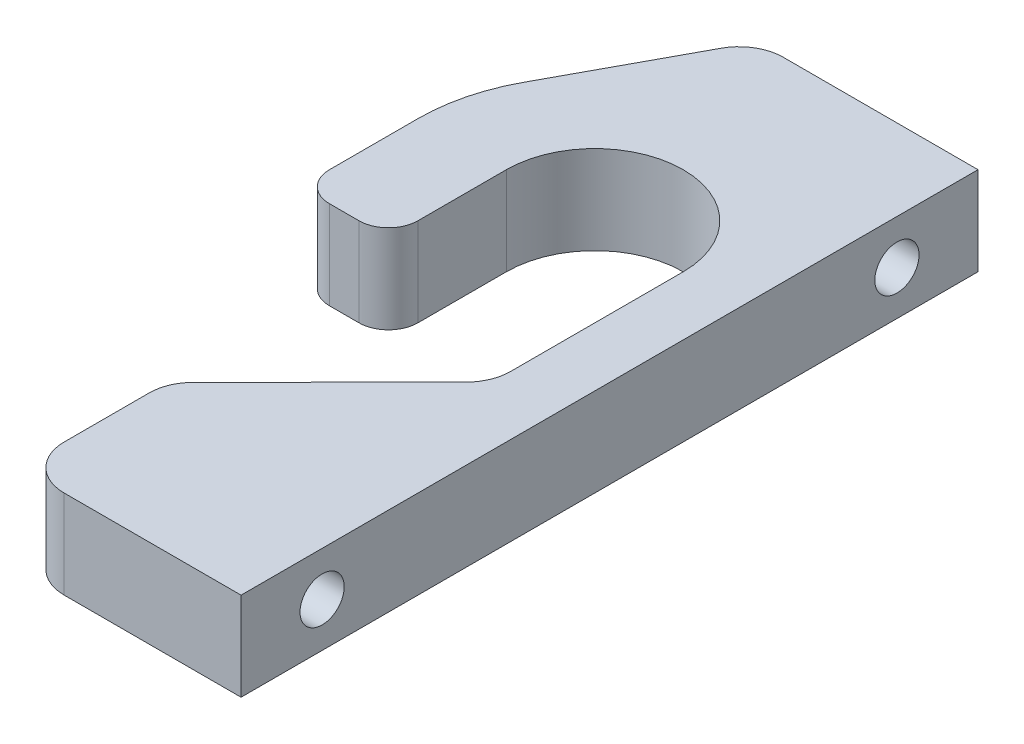
ISO-10303-21;
HEADER;
FILE_DESCRIPTION(('STEP AP214'),'2;1');
FILE_NAME('part.step','',(''),(''),'','','');
FILE_SCHEMA(('AUTOMOTIVE_DESIGN { 1 0 10303 214 1 1 1 1 }'));
ENDSEC;
DATA;
#1=APPLICATION_CONTEXT('core data for automotive mechanical design processes');
#2=APPLICATION_PROTOCOL_DEFINITION('international standard','automotive_design',2000,#1);
#3=PRODUCT_CONTEXT('',#1,'mechanical');
#4=PRODUCT('Part','Part','',(#3));
#5=PRODUCT_RELATED_PRODUCT_CATEGORY('part','',(#4));
#6=PRODUCT_DEFINITION_FORMATION('','',#4);
#7=PRODUCT_DEFINITION_CONTEXT('part definition',#1,'design');
#8=PRODUCT_DEFINITION('design','',#6,#7);
#9=PRODUCT_DEFINITION_SHAPE('','',#8);
#10=(LENGTH_UNIT() NAMED_UNIT(*) SI_UNIT(.MILLI.,.METRE.));
#11=(NAMED_UNIT(*) PLANE_ANGLE_UNIT() SI_UNIT($,.RADIAN.));
#12=(NAMED_UNIT(*) SI_UNIT($,.STERADIAN.) SOLID_ANGLE_UNIT());
#13=UNCERTAINTY_MEASURE_WITH_UNIT(LENGTH_MEASURE(1.E-05),#10,'distance_accuracy_value','');
#14=(GEOMETRIC_REPRESENTATION_CONTEXT(3) GLOBAL_UNCERTAINTY_ASSIGNED_CONTEXT((#13)) GLOBAL_UNIT_ASSIGNED_CONTEXT((#10,
#11,#12)) REPRESENTATION_CONTEXT('',''));
#15=CARTESIAN_POINT('',(0.,0.,0.));
#16=DIRECTION('',(0.,0.,1.));
#17=DIRECTION('',(1.,0.,0.));
#18=AXIS2_PLACEMENT_3D('',#15,#16,#17);
#19=CARTESIAN_POINT('',(0.,3.,0.));
#20=DIRECTION('',(0.,-1.,0.));
#21=DIRECTION('',(0.,0.,-1.));
#22=AXIS2_PLACEMENT_3D('',#19,#20,#21);
#23=CYLINDRICAL_SURFACE('',#22,6.);
#24=CARTESIAN_POINT('',(0.,-3.,0.));
#25=DIRECTION('',(0.,-1.,0.));
#26=DIRECTION('',(0.,0.,1.));
#27=AXIS2_PLACEMENT_3D('',#24,#25,#26);
#28=CIRCLE('',#27,6.);
#29=CARTESIAN_POINT('',(-6.,-3.,0.));
#30=VERTEX_POINT('',#29);
#31=CARTESIAN_POINT('',(6.,-3.,0.));
#32=VERTEX_POINT('',#31);
#33=EDGE_CURVE('E193',#30,#32,#28,.T.);
#34=ORIENTED_EDGE('',*,*,#33,.T.);
#35=DIRECTION('',(0.,-1.,0.));
#36=VECTOR('',#35,1.);
#37=CARTESIAN_POINT('',(6.,3.,0.));
#38=LINE('',#37,#36);
#39=CARTESIAN_POINT('',(6.,3.,0.));
#40=VERTEX_POINT('',#39);
#41=EDGE_CURVE('E172',#40,#32,#38,.T.);
#42=ORIENTED_EDGE('',*,*,#41,.F.);
#43=CARTESIAN_POINT('',(0.,3.,0.));
#44=DIRECTION('',(0.,-1.,0.));
#45=DIRECTION('',(0.,0.,1.));
#46=AXIS2_PLACEMENT_3D('',#43,#44,#45);
#47=CIRCLE('',#46,6.);
#48=CARTESIAN_POINT('',(-6.,3.,0.));
#49=VERTEX_POINT('',#48);
#50=EDGE_CURVE('E180',#49,#40,#47,.T.);
#51=ORIENTED_EDGE('',*,*,#50,.F.);
#52=DIRECTION('',(0.,-1.,0.));
#53=VECTOR('',#52,1.);
#54=CARTESIAN_POINT('',(-6.,3.,0.));
#55=LINE('',#54,#53);
#56=EDGE_CURVE('E280',#49,#30,#55,.T.);
#57=ORIENTED_EDGE('',*,*,#56,.T.);
#58=EDGE_LOOP('',(#34,#42,#51,#57));
#59=FACE_BOUND('',#58,.T.);
#60=ADVANCED_FACE('F39',(#59),#23,.F.);
#61=CARTESIAN_POINT('',(6.,3.,0.));
#62=DIRECTION('',(1.,0.,0.));
#63=DIRECTION('',(0.,0.,-1.));
#64=AXIS2_PLACEMENT_3D('',#61,#62,#63);
#65=PLANE('',#64);
#66=DIRECTION('',(0.,0.,1.));
#67=VECTOR('',#66,1.);
#68=CARTESIAN_POINT('',(6.,-3.,0.));
#69=LINE('',#68,#67);
#70=CARTESIAN_POINT('',(6.,-3.,11.7175913604145));
#71=VERTEX_POINT('',#70);
#72=EDGE_CURVE('E357',#32,#71,#69,.T.);
#73=ORIENTED_EDGE('',*,*,#72,.T.);
#74=DIRECTION('',(0.,-1.,0.));
#75=VECTOR('',#74,1.);
#76=CARTESIAN_POINT('',(6.,3.,11.7175913604145));
#77=LINE('',#76,#75);
#78=CARTESIAN_POINT('',(6.,3.,11.7175913604145));
#79=VERTEX_POINT('',#78);
#80=EDGE_CURVE('E175',#71,#79,#77,.F.);
#81=ORIENTED_EDGE('',*,*,#80,.T.);
#82=DIRECTION('',(0.,0.,1.));
#83=VECTOR('',#82,1.);
#84=CARTESIAN_POINT('',(6.,3.,0.));
#85=LINE('',#84,#83);
#86=EDGE_CURVE('E167',#40,#79,#85,.T.);
#87=ORIENTED_EDGE('',*,*,#86,.F.);
#88=ORIENTED_EDGE('',*,*,#41,.T.);
#89=EDGE_LOOP('',(#73,#81,#87,#88));
#90=FACE_BOUND('',#89,.T.);
#91=ADVANCED_FACE('F170',(#90),#65,.F.);
#92=CARTESIAN_POINT('',(6.,3.,12.9567884805526));
#93=DIRECTION('',(0.708491568107994,0.,0.70571927699325));
#94=DIRECTION('',(0.70571927699325,0.,-0.708491568107994));
#95=AXIS2_PLACEMENT_3D('',#92,#93,#94);
#96=PLANE('',#95);
#97=DIRECTION('',(-0.70571927699325,0.,0.708491568107994));
#98=VECTOR('',#97,1.);
#99=CARTESIAN_POINT('',(6.,-3.,12.9567884805526));
#100=LINE('',#99,#98);
#101=CARTESIAN_POINT('',(5.12547470432399,-3.,13.8347491913942));
#102=VERTEX_POINT('',#101);
#103=CARTESIAN_POINT('',(-4.12547470432397,-3.,23.1220392891584));
#104=VERTEX_POINT('',#103);
#105=EDGE_CURVE('E361',#102,#104,#100,.T.);
#106=ORIENTED_EDGE('',*,*,#105,.T.);
#107=DIRECTION('',(0.,-1.,0.));
#108=VECTOR('',#107,1.);
#109=CARTESIAN_POINT('',(-4.12547470432397,3.,23.1220392891584));
#110=LINE('',#109,#108);
#111=CARTESIAN_POINT('',(-4.12547470432397,3.,23.1220392891584));
#112=VERTEX_POINT('',#111);
#113=EDGE_CURVE('E243',#104,#112,#110,.F.);
#114=ORIENTED_EDGE('',*,*,#113,.T.);
#115=DIRECTION('',(-0.70571927699325,0.,0.708491568107994));
#116=VECTOR('',#115,1.);
#117=CARTESIAN_POINT('',(6.,3.,12.9567884805526));
#118=LINE('',#117,#116);
#119=CARTESIAN_POINT('',(5.12547470432399,3.,13.8347491913942));
#120=VERTEX_POINT('',#119);
#121=EDGE_CURVE('E179',#120,#112,#118,.T.);
#122=ORIENTED_EDGE('',*,*,#121,.F.);
#123=DIRECTION('',(0.,-1.,0.));
#124=VECTOR('',#123,1.);
#125=CARTESIAN_POINT('',(5.12547470432398,-3.,13.8347491913942));
#126=LINE('',#125,#124);
#127=EDGE_CURVE('E239',#120,#102,#126,.T.);
#128=ORIENTED_EDGE('',*,*,#127,.T.);
#129=EDGE_LOOP('',(#106,#114,#122,#128));
#130=FACE_BOUND('',#129,.T.);
#131=ADVANCED_FACE('F415',(#130),#96,.F.);
#132=CARTESIAN_POINT('',(-4.99999999999999,3.,24.));
#133=DIRECTION('',(1.,0.,0.));
#134=DIRECTION('',(0.,0.,-1.));
#135=AXIS2_PLACEMENT_3D('',#132,#133,#134);
#136=PLANE('',#135);
#137=DIRECTION('',(0.,0.,1.));
#138=VECTOR('',#137,1.);
#139=CARTESIAN_POINT('',(-4.99999999999999,-3.,24.));
#140=LINE('',#139,#138);
#141=CARTESIAN_POINT('',(-4.99999999999999,-3.,25.2391971201382));
#142=VERTEX_POINT('',#141);
#143=CARTESIAN_POINT('',(-4.99999999999999,-3.,31.));
#144=VERTEX_POINT('',#143);
#145=EDGE_CURVE('E365',#142,#144,#140,.T.);
#146=ORIENTED_EDGE('',*,*,#145,.T.);
#147=DIRECTION('',(0.,-1.,0.));
#148=VECTOR('',#147,1.);
#149=CARTESIAN_POINT('',(-4.99999999999999,3.,31.));
#150=LINE('',#149,#148);
#151=CARTESIAN_POINT('',(-4.99999999999999,3.,31.));
#152=VERTEX_POINT('',#151);
#153=EDGE_CURVE('E220',#144,#152,#150,.F.);
#154=ORIENTED_EDGE('',*,*,#153,.T.);
#155=DIRECTION('',(0.,0.,1.));
#156=VECTOR('',#155,1.);
#157=CARTESIAN_POINT('',(-4.99999999999999,3.,24.));
#158=LINE('',#157,#156);
#159=CARTESIAN_POINT('',(-4.99999999999999,3.,25.2391971201382));
#160=VERTEX_POINT('',#159);
#161=EDGE_CURVE('E383',#160,#152,#158,.T.);
#162=ORIENTED_EDGE('',*,*,#161,.F.);
#163=DIRECTION('',(0.,-1.,0.));
#164=VECTOR('',#163,1.);
#165=CARTESIAN_POINT('',(-4.99999999999999,3.,25.2391971201382));
#166=LINE('',#165,#164);
#167=EDGE_CURVE('E216',#160,#142,#166,.T.);
#168=ORIENTED_EDGE('',*,*,#167,.T.);
#169=EDGE_LOOP('',(#146,#154,#162,#168));
#170=FACE_BOUND('',#169,.T.);
#171=ADVANCED_FACE('F420',(#170),#136,.F.);
#172=CARTESIAN_POINT('',(-4.99999999999999,3.,34.));
#173=DIRECTION('',(0.,0.,-1.));
#174=DIRECTION('',(-1.,0.,0.));
#175=AXIS2_PLACEMENT_3D('',#172,#173,#174);
#176=PLANE('',#175);
#177=DIRECTION('',(1.,0.,0.));
#178=VECTOR('',#177,1.);
#179=CARTESIAN_POINT('',(-4.99999999999999,3.,34.));
#180=LINE('',#179,#178);
#181=CARTESIAN_POINT('',(-1.99999999999999,3.,34.));
#182=VERTEX_POINT('',#181);
#183=CARTESIAN_POINT('',(10.,3.,34.));
#184=VERTEX_POINT('',#183);
#185=EDGE_CURVE('E377',#182,#184,#180,.T.);
#186=ORIENTED_EDGE('',*,*,#185,.F.);
#187=DIRECTION('',(0.,-1.,0.));
#188=VECTOR('',#187,1.);
#189=CARTESIAN_POINT('',(-1.99999999999999,3.,34.));
#190=LINE('',#189,#188);
#191=CARTESIAN_POINT('',(-1.99999999999999,-3.,34.));
#192=VERTEX_POINT('',#191);
#193=EDGE_CURVE('E195',#182,#192,#190,.T.);
#194=ORIENTED_EDGE('',*,*,#193,.T.);
#195=DIRECTION('',(1.,0.,0.));
#196=VECTOR('',#195,1.);
#197=CARTESIAN_POINT('',(-4.99999999999999,-3.,34.));
#198=LINE('',#197,#196);
#199=CARTESIAN_POINT('',(10.,-3.,34.));
#200=VERTEX_POINT('',#199);
#201=EDGE_CURVE('E333',#192,#200,#198,.T.);
#202=ORIENTED_EDGE('',*,*,#201,.T.);
#203=DIRECTION('',(0.,-1.,0.));
#204=VECTOR('',#203,1.);
#205=CARTESIAN_POINT('',(10.,3.,34.));
#206=LINE('',#205,#204);
#207=EDGE_CURVE('E196',#184,#200,#206,.T.);
#208=ORIENTED_EDGE('',*,*,#207,.F.);
#209=EDGE_LOOP('',(#186,#194,#202,#208));
#210=FACE_BOUND('',#209,.T.);
#211=ADVANCED_FACE('F372',(#210),#176,.F.);
#212=CARTESIAN_POINT('',(10.,3.,34.));
#213=DIRECTION('',(-1.,0.,0.));
#214=DIRECTION('',(0.,0.,1.));
#215=AXIS2_PLACEMENT_3D('',#212,#213,#214);
#216=PLANE('',#215);
#217=CARTESIAN_POINT('',(10.,0.,28.5));
#218=DIRECTION('',(1.,0.,0.));
#219=DIRECTION('',(0.,0.,-1.));
#220=AXIS2_PLACEMENT_3D('',#217,#218,#219);
#221=CIRCLE('',#220,1.5);
#222=CARTESIAN_POINT('',(10.,0.,27.));
#223=VERTEX_POINT('',#222);
#224=EDGE_CURVE('E465',#223,#223,#221,.T.);
#225=ORIENTED_EDGE('',*,*,#224,.F.);
#226=EDGE_LOOP('',(#225));
#227=FACE_BOUND('',#226,.T.);
#228=CARTESIAN_POINT('',(10.,0.,-10.5));
#229=DIRECTION('',(1.,0.,0.));
#230=DIRECTION('',(0.,0.,-1.));
#231=AXIS2_PLACEMENT_3D('',#228,#229,#230);
#232=CIRCLE('',#231,1.5);
#233=CARTESIAN_POINT('',(10.,0.,-12.));
#234=VERTEX_POINT('',#233);
#235=EDGE_CURVE('E475',#234,#234,#232,.T.);
#236=ORIENTED_EDGE('',*,*,#235,.F.);
#237=EDGE_LOOP('',(#236));
#238=FACE_BOUND('',#237,.T.);
#239=DIRECTION('',(0.,0.,-1.));
#240=VECTOR('',#239,1.);
#241=CARTESIAN_POINT('',(10.,-3.,34.));
#242=LINE('',#241,#240);
#243=CARTESIAN_POINT('',(10.,-3.,-16.));
#244=VERTEX_POINT('',#243);
#245=EDGE_CURVE('E325',#200,#244,#242,.T.);
#246=ORIENTED_EDGE('',*,*,#245,.T.);
#247=DIRECTION('',(0.,-1.,0.));
#248=VECTOR('',#247,1.);
#249=CARTESIAN_POINT('',(10.,3.,-16.));
#250=LINE('',#249,#248);
#251=CARTESIAN_POINT('',(10.,3.,-16.));
#252=VERTEX_POINT('',#251);
#253=EDGE_CURVE('E204',#252,#244,#250,.T.);
#254=ORIENTED_EDGE('',*,*,#253,.F.);
#255=DIRECTION('',(0.,0.,-1.));
#256=VECTOR('',#255,1.);
#257=CARTESIAN_POINT('',(10.,3.,34.));
#258=LINE('',#257,#256);
#259=EDGE_CURVE('E375',#184,#252,#258,.T.);
#260=ORIENTED_EDGE('',*,*,#259,.F.);
#261=ORIENTED_EDGE('',*,*,#207,.T.);
#262=EDGE_LOOP('',(#246,#254,#260,#261));
#263=FACE_BOUND('',#262,.T.);
#264=ADVANCED_FACE('F374',(#227,#238,#263),#216,.F.);
#265=CARTESIAN_POINT('',(-5.,3.,-16.));
#266=DIRECTION('',(0.,0.,1.));
#267=DIRECTION('',(1.,0.,0.));
#268=AXIS2_PLACEMENT_3D('',#265,#266,#267);
#269=PLANE('',#268);
#270=DIRECTION('',(-1.,0.,0.));
#271=VECTOR('',#270,1.);
#272=CARTESIAN_POINT('',(-5.,-3.,-16.));
#273=LINE('',#272,#271);
#274=CARTESIAN_POINT('',(-3.21021072385147,-3.,-16.));
#275=VERTEX_POINT('',#274);
#276=EDGE_CURVE('E317',#244,#275,#273,.T.);
#277=ORIENTED_EDGE('',*,*,#276,.T.);
#278=DIRECTION('',(0.,-1.,0.));
#279=VECTOR('',#278,1.);
#280=CARTESIAN_POINT('',(-3.21021072385147,3.,-16.));
#281=LINE('',#280,#279);
#282=CARTESIAN_POINT('',(-3.21021072385147,3.,-16.));
#283=VERTEX_POINT('',#282);
#284=EDGE_CURVE('E236',#275,#283,#281,.F.);
#285=ORIENTED_EDGE('',*,*,#284,.T.);
#286=DIRECTION('',(-1.,0.,0.));
#287=VECTOR('',#286,1.);
#288=CARTESIAN_POINT('',(-5.,3.,-16.));
#289=LINE('',#288,#287);
#290=EDGE_CURVE('E320',#252,#283,#289,.T.);
#291=ORIENTED_EDGE('',*,*,#290,.F.);
#292=ORIENTED_EDGE('',*,*,#253,.T.);
#293=EDGE_LOOP('',(#277,#285,#291,#292));
#294=FACE_BOUND('',#293,.T.);
#295=ADVANCED_FACE('F316',(#294),#269,.F.);
#296=CARTESIAN_POINT('',(-10.5597949567906,3.,-5.70006407600293));
#297=DIRECTION('',(0.879982913065886,0.,0.475005339666911));
#298=DIRECTION('',(0.475005339666911,0.,-0.879982913065886));
#299=AXIS2_PLACEMENT_3D('',#296,#297,#298);
#300=PLANE('',#299);
#301=DIRECTION('',(-0.475005339666911,0.,0.879982913065886));
#302=VECTOR('',#301,1.);
#303=CARTESIAN_POINT('',(-10.5597949567906,3.,-5.70006407600293));
#304=LINE('',#303,#302);
#305=CARTESIAN_POINT('',(-5.85015946304912,3.,-14.4250160190007));
#306=VERTEX_POINT('',#305);
#307=CARTESIAN_POINT('',(-10.5597949567906,3.,-5.70006407600293));
#308=VERTEX_POINT('',#307);
#309=EDGE_CURVE('E381',#306,#308,#304,.T.);
#310=ORIENTED_EDGE('',*,*,#309,.F.);
#311=DIRECTION('',(0.,-1.,0.));
#312=VECTOR('',#311,1.);
#313=CARTESIAN_POINT('',(-5.85015946304912,3.,-14.4250160190007));
#314=LINE('',#313,#312);
#315=CARTESIAN_POINT('',(-5.85015946304912,-3.,-14.4250160190007));
#316=VERTEX_POINT('',#315);
#317=EDGE_CURVE('E232',#306,#316,#314,.T.);
#318=ORIENTED_EDGE('',*,*,#317,.T.);
#319=DIRECTION('',(-0.475005339666911,0.,0.879982913065886));
#320=VECTOR('',#319,1.);
#321=CARTESIAN_POINT('',(-10.5597949567906,-3.,-5.70006407600293));
#322=LINE('',#321,#320);
#323=CARTESIAN_POINT('',(-10.5597949567906,-3.,-5.70006407600293));
#324=VERTEX_POINT('',#323);
#325=EDGE_CURVE('E328',#316,#324,#322,.T.);
#326=ORIENTED_EDGE('',*,*,#325,.T.);
#327=DIRECTION('',(0.,-1.,0.));
#328=VECTOR('',#327,1.);
#329=CARTESIAN_POINT('',(-10.5597949567906,3.,-5.70006407600293));
#330=LINE('',#329,#328);
#331=EDGE_CURVE('E306',#308,#324,#330,.T.);
#332=ORIENTED_EDGE('',*,*,#331,.F.);
#333=EDGE_LOOP('',(#310,#318,#326,#332));
#334=FACE_BOUND('',#333,.T.);
#335=ADVANCED_FACE('F393',(#334),#300,.F.);
#336=CARTESIAN_POINT('',(0.,3.,0.));
#337=DIRECTION('',(0.,-1.,0.));
#338=DIRECTION('',(0.,0.,-1.));
#339=AXIS2_PLACEMENT_3D('',#336,#337,#338);
#340=CYLINDRICAL_SURFACE('',#339,12.);
#341=CARTESIAN_POINT('',(0.,-3.,0.));
#342=DIRECTION('',(0.,1.,0.));
#343=DIRECTION('',(0.,0.,1.));
#344=AXIS2_PLACEMENT_3D('',#341,#342,#343);
#345=CIRCLE('',#344,12.);
#346=CARTESIAN_POINT('',(-12.,-3.,0.));
#347=VERTEX_POINT('',#346);
#348=EDGE_CURVE('E296',#324,#347,#345,.T.);
#349=ORIENTED_EDGE('',*,*,#348,.T.);
#350=DIRECTION('',(0.,-1.,0.));
#351=VECTOR('',#350,1.);
#352=CARTESIAN_POINT('',(-12.,3.,0.));
#353=LINE('',#352,#351);
#354=CARTESIAN_POINT('',(-12.,3.,0.));
#355=VERTEX_POINT('',#354);
#356=EDGE_CURVE('E302',#355,#347,#353,.T.);
#357=ORIENTED_EDGE('',*,*,#356,.F.);
#358=CARTESIAN_POINT('',(0.,3.,0.));
#359=DIRECTION('',(0.,1.,0.));
#360=DIRECTION('',(0.,0.,1.));
#361=AXIS2_PLACEMENT_3D('',#358,#359,#360);
#362=CIRCLE('',#361,12.);
#363=EDGE_CURVE('E351',#308,#355,#362,.T.);
#364=ORIENTED_EDGE('',*,*,#363,.F.);
#365=ORIENTED_EDGE('',*,*,#331,.T.);
#366=EDGE_LOOP('',(#349,#357,#364,#365));
#367=FACE_BOUND('',#366,.T.);
#368=ADVANCED_FACE('F340',(#367),#340,.T.);
#369=CARTESIAN_POINT('',(-12.,3.,0.));
#370=DIRECTION('',(1.,0.,0.));
#371=DIRECTION('',(0.,0.,-1.));
#372=AXIS2_PLACEMENT_3D('',#369,#370,#371);
#373=PLANE('',#372);
#374=DIRECTION('',(0.,0.,1.));
#375=VECTOR('',#374,1.);
#376=CARTESIAN_POINT('',(-12.,-3.,0.));
#377=LINE('',#376,#375);
#378=CARTESIAN_POINT('',(-12.,-3.,6.));
#379=VERTEX_POINT('',#378);
#380=EDGE_CURVE('E291',#347,#379,#377,.T.);
#381=ORIENTED_EDGE('',*,*,#380,.T.);
#382=DIRECTION('',(0.,-1.,0.));
#383=VECTOR('',#382,1.);
#384=CARTESIAN_POINT('',(-12.,3.,6.));
#385=LINE('',#384,#383);
#386=CARTESIAN_POINT('',(-12.,3.,6.));
#387=VERTEX_POINT('',#386);
#388=EDGE_CURVE('E11',#379,#387,#385,.F.);
#389=ORIENTED_EDGE('',*,*,#388,.T.);
#390=DIRECTION('',(0.,0.,1.));
#391=VECTOR('',#390,1.);
#392=CARTESIAN_POINT('',(-12.,3.,0.));
#393=LINE('',#392,#391);
#394=EDGE_CURVE('E345',#355,#387,#393,.T.);
#395=ORIENTED_EDGE('',*,*,#394,.F.);
#396=ORIENTED_EDGE('',*,*,#356,.T.);
#397=EDGE_LOOP('',(#381,#389,#395,#396));
#398=FACE_BOUND('',#397,.T.);
#399=ADVANCED_FACE('F344',(#398),#373,.F.);
#400=CARTESIAN_POINT('',(-12.,3.,8.));
#401=DIRECTION('',(0.,0.,-1.));
#402=DIRECTION('',(-1.,0.,0.));
#403=AXIS2_PLACEMENT_3D('',#400,#401,#402);
#404=PLANE('',#403);
#405=DIRECTION('',(1.,0.,0.));
#406=VECTOR('',#405,1.);
#407=CARTESIAN_POINT('',(-12.,-3.,8.));
#408=LINE('',#407,#406);
#409=CARTESIAN_POINT('',(-10.,-3.,8.));
#410=VERTEX_POINT('',#409);
#411=CARTESIAN_POINT('',(-8.,-3.,8.));
#412=VERTEX_POINT('',#411);
#413=EDGE_CURVE('E287',#410,#412,#408,.T.);
#414=ORIENTED_EDGE('',*,*,#413,.T.);
#415=DIRECTION('',(0.,-1.,0.));
#416=VECTOR('',#415,1.);
#417=CARTESIAN_POINT('',(-8.,3.,8.));
#418=LINE('',#417,#416);
#419=CARTESIAN_POINT('',(-8.,3.,8.));
#420=VERTEX_POINT('',#419);
#421=EDGE_CURVE('E61',#412,#420,#418,.F.);
#422=ORIENTED_EDGE('',*,*,#421,.T.);
#423=DIRECTION('',(1.,0.,0.));
#424=VECTOR('',#423,1.);
#425=CARTESIAN_POINT('',(-12.,3.,8.));
#426=LINE('',#425,#424);
#427=CARTESIAN_POINT('',(-10.,3.,8.));
#428=VERTEX_POINT('',#427);
#429=EDGE_CURVE('E274',#428,#420,#426,.T.);
#430=ORIENTED_EDGE('',*,*,#429,.F.);
#431=DIRECTION('',(0.,-1.,0.));
#432=VECTOR('',#431,1.);
#433=CARTESIAN_POINT('',(-10.,3.,8.));
#434=LINE('',#433,#432);
#435=EDGE_CURVE('E264',#428,#410,#434,.T.);
#436=ORIENTED_EDGE('',*,*,#435,.T.);
#437=EDGE_LOOP('',(#414,#422,#430,#436));
#438=FACE_BOUND('',#437,.T.);
#439=ADVANCED_FACE('F288',(#438),#404,.F.);
#440=CARTESIAN_POINT('',(-6.,3.,8.));
#441=DIRECTION('',(-1.,0.,0.));
#442=DIRECTION('',(0.,0.,1.));
#443=AXIS2_PLACEMENT_3D('',#440,#441,#442);
#444=PLANE('',#443);
#445=DIRECTION('',(0.,0.,-1.));
#446=VECTOR('',#445,1.);
#447=CARTESIAN_POINT('',(-6.,3.,8.));
#448=LINE('',#447,#446);
#449=CARTESIAN_POINT('',(-6.,3.,6.));
#450=VERTEX_POINT('',#449);
#451=EDGE_CURVE('E185',#450,#49,#448,.T.);
#452=ORIENTED_EDGE('',*,*,#451,.F.);
#453=DIRECTION('',(0.,-1.,0.));
#454=VECTOR('',#453,1.);
#455=CARTESIAN_POINT('',(-6.,3.,6.));
#456=LINE('',#455,#454);
#457=CARTESIAN_POINT('',(-6.,-3.,6.));
#458=VERTEX_POINT('',#457);
#459=EDGE_CURVE('E254',#450,#458,#456,.T.);
#460=ORIENTED_EDGE('',*,*,#459,.T.);
#461=DIRECTION('',(0.,0.,-1.));
#462=VECTOR('',#461,1.);
#463=CARTESIAN_POINT('',(-6.,-3.,8.));
#464=LINE('',#463,#462);
#465=EDGE_CURVE('E190',#458,#30,#464,.T.);
#466=ORIENTED_EDGE('',*,*,#465,.T.);
#467=ORIENTED_EDGE('',*,*,#56,.F.);
#468=EDGE_LOOP('',(#452,#460,#466,#467));
#469=FACE_BOUND('',#468,.T.);
#470=ADVANCED_FACE('F278',(#469),#444,.F.);
#471=CARTESIAN_POINT('',(0.,3.,0.));
#472=DIRECTION('',(0.,1.,0.));
#473=DIRECTION('',(0.,0.,1.));
#474=AXIS2_PLACEMENT_3D('',#471,#472,#473);
#475=PLANE('',#474);
#476=ORIENTED_EDGE('',*,*,#429,.T.);
#477=CARTESIAN_POINT('',(-8.,3.,6.));
#478=DIRECTION('',(0.,1.,0.));
#479=DIRECTION('',(0.,0.,1.));
#480=AXIS2_PLACEMENT_3D('',#477,#478,#479);
#481=CIRCLE('',#480,2.);
#482=EDGE_CURVE('E48',#420,#450,#481,.T.);
#483=ORIENTED_EDGE('',*,*,#482,.T.);
#484=ORIENTED_EDGE('',*,*,#451,.T.);
#485=ORIENTED_EDGE('',*,*,#50,.T.);
#486=ORIENTED_EDGE('',*,*,#86,.T.);
#487=CARTESIAN_POINT('',(3.,3.,11.7175913604145));
#488=DIRECTION('',(0.,1.,0.));
#489=DIRECTION('',(0.,0.,1.));
#490=AXIS2_PLACEMENT_3D('',#487,#488,#489);
#491=CIRCLE('',#490,3.);
#492=EDGE_CURVE('E251',#79,#120,#491,.F.);
#493=ORIENTED_EDGE('',*,*,#492,.T.);
#494=ORIENTED_EDGE('',*,*,#121,.T.);
#495=CARTESIAN_POINT('',(-1.99999999999999,3.,25.2391971201382));
#496=DIRECTION('',(0.,1.,0.));
#497=DIRECTION('',(0.,0.,1.));
#498=AXIS2_PLACEMENT_3D('',#495,#496,#497);
#499=CIRCLE('',#498,3.);
#500=EDGE_CURVE('E223',#112,#160,#499,.T.);
#501=ORIENTED_EDGE('',*,*,#500,.T.);
#502=ORIENTED_EDGE('',*,*,#161,.T.);
#503=CARTESIAN_POINT('',(-1.99999999999999,3.,31.));
#504=DIRECTION('',(0.,1.,0.));
#505=DIRECTION('',(0.,0.,1.));
#506=AXIS2_PLACEMENT_3D('',#503,#504,#505);
#507=CIRCLE('',#506,3.);
#508=EDGE_CURVE('E229',#152,#182,#507,.T.);
#509=ORIENTED_EDGE('',*,*,#508,.T.);
#510=ORIENTED_EDGE('',*,*,#185,.T.);
#511=ORIENTED_EDGE('',*,*,#259,.T.);
#512=ORIENTED_EDGE('',*,*,#290,.T.);
#513=CARTESIAN_POINT('',(-3.21021072385147,3.,-13.));
#514=DIRECTION('',(0.,1.,0.));
#515=DIRECTION('',(0.,0.,1.));
#516=AXIS2_PLACEMENT_3D('',#513,#514,#515);
#517=CIRCLE('',#516,3.);
#518=EDGE_CURVE('E226',#283,#306,#517,.T.);
#519=ORIENTED_EDGE('',*,*,#518,.T.);
#520=ORIENTED_EDGE('',*,*,#309,.T.);
#521=ORIENTED_EDGE('',*,*,#363,.T.);
#522=ORIENTED_EDGE('',*,*,#394,.T.);
#523=CARTESIAN_POINT('',(-10.,3.,6.));
#524=DIRECTION('',(0.,1.,0.));
#525=DIRECTION('',(0.,0.,1.));
#526=AXIS2_PLACEMENT_3D('',#523,#524,#525);
#527=CIRCLE('',#526,2.);
#528=EDGE_CURVE('E270',#387,#428,#527,.T.);
#529=ORIENTED_EDGE('',*,*,#528,.T.);
#530=EDGE_LOOP('',(#476,#483,#484,#485,#486,#493,#494,#501,#502,#509,#510,#511,#512,#519,#520,
#521,#522,#529));
#531=FACE_BOUND('',#530,.T.);
#532=ADVANCED_FACE('F183',(#531),#475,.T.);
#533=CARTESIAN_POINT('',(0.,-3.,0.));
#534=DIRECTION('',(0.,1.,0.));
#535=DIRECTION('',(0.,0.,1.));
#536=AXIS2_PLACEMENT_3D('',#533,#534,#535);
#537=PLANE('',#536);
#538=ORIENTED_EDGE('',*,*,#465,.F.);
#539=CARTESIAN_POINT('',(-8.,-3.,6.));
#540=DIRECTION('',(0.,1.,0.));
#541=DIRECTION('',(0.,0.,1.));
#542=AXIS2_PLACEMENT_3D('',#539,#540,#541);
#543=CIRCLE('',#542,2.);
#544=EDGE_CURVE('E261',#458,#412,#543,.F.);
#545=ORIENTED_EDGE('',*,*,#544,.T.);
#546=ORIENTED_EDGE('',*,*,#413,.F.);
#547=CARTESIAN_POINT('',(-10.,-3.,6.));
#548=DIRECTION('',(0.,1.,0.));
#549=DIRECTION('',(0.,0.,1.));
#550=AXIS2_PLACEMENT_3D('',#547,#548,#549);
#551=CIRCLE('',#550,2.);
#552=EDGE_CURVE('E258',#410,#379,#551,.F.);
#553=ORIENTED_EDGE('',*,*,#552,.T.);
#554=ORIENTED_EDGE('',*,*,#380,.F.);
#555=ORIENTED_EDGE('',*,*,#348,.F.);
#556=ORIENTED_EDGE('',*,*,#325,.F.);
#557=CARTESIAN_POINT('',(-3.21021072385147,-3.,-13.));
#558=DIRECTION('',(0.,1.,0.));
#559=DIRECTION('',(0.,0.,1.));
#560=AXIS2_PLACEMENT_3D('',#557,#558,#559);
#561=CIRCLE('',#560,3.);
#562=EDGE_CURVE('E210',#316,#275,#561,.F.);
#563=ORIENTED_EDGE('',*,*,#562,.T.);
#564=ORIENTED_EDGE('',*,*,#276,.F.);
#565=ORIENTED_EDGE('',*,*,#245,.F.);
#566=ORIENTED_EDGE('',*,*,#201,.F.);
#567=CARTESIAN_POINT('',(-1.99999999999999,-3.,31.));
#568=DIRECTION('',(0.,1.,0.));
#569=DIRECTION('',(0.,0.,1.));
#570=AXIS2_PLACEMENT_3D('',#567,#568,#569);
#571=CIRCLE('',#570,3.);
#572=EDGE_CURVE('E213',#192,#144,#571,.F.);
#573=ORIENTED_EDGE('',*,*,#572,.T.);
#574=ORIENTED_EDGE('',*,*,#145,.F.);
#575=CARTESIAN_POINT('',(-1.99999999999999,-3.,25.2391971201382));
#576=DIRECTION('',(0.,1.,0.));
#577=DIRECTION('',(0.,0.,1.));
#578=AXIS2_PLACEMENT_3D('',#575,#576,#577);
#579=CIRCLE('',#578,3.);
#580=EDGE_CURVE('E201',#142,#104,#579,.F.);
#581=ORIENTED_EDGE('',*,*,#580,.T.);
#582=ORIENTED_EDGE('',*,*,#105,.F.);
#583=CARTESIAN_POINT('',(3.,-3.,11.7175913604145));
#584=DIRECTION('',(0.,1.,0.));
#585=DIRECTION('',(0.,0.,1.));
#586=AXIS2_PLACEMENT_3D('',#583,#584,#585);
#587=CIRCLE('',#586,3.);
#588=EDGE_CURVE('E248',#102,#71,#587,.T.);
#589=ORIENTED_EDGE('',*,*,#588,.T.);
#590=ORIENTED_EDGE('',*,*,#72,.F.);
#591=ORIENTED_EDGE('',*,*,#33,.F.);
#592=EDGE_LOOP('',(#538,#545,#546,#553,#554,#555,#556,#563,#564,#565,#566,#573,#574,#581,#582,
#589,#590,#591));
#593=FACE_BOUND('',#592,.T.);
#594=ADVANCED_FACE('F286',(#593),#537,.F.);
#595=CARTESIAN_POINT('',(0.,0.,-10.5));
#596=DIRECTION('',(1.,0.,0.));
#597=DIRECTION('',(0.,0.,-1.));
#598=AXIS2_PLACEMENT_3D('',#595,#596,#597);
#599=CYLINDRICAL_SURFACE('',#598,1.5);
#600=CARTESIAN_POINT('',(0.,0.,-10.5));
#601=DIRECTION('',(1.,0.,0.));
#602=DIRECTION('',(0.,0.,-1.));
#603=AXIS2_PLACEMENT_3D('',#600,#601,#602);
#604=CIRCLE('',#603,1.5);
#605=CARTESIAN_POINT('',(0.,0.,-12.));
#606=VERTEX_POINT('',#605);
#607=EDGE_CURVE('E469',#606,#606,#604,.T.);
#608=ORIENTED_EDGE('',*,*,#607,.F.);
#609=EDGE_LOOP('',(#608));
#610=FACE_BOUND('',#609,.T.);
#611=ORIENTED_EDGE('',*,*,#235,.T.);
#612=EDGE_LOOP('',(#611));
#613=FACE_BOUND('',#612,.T.);
#614=ADVANCED_FACE('F444',(#610,#613),#599,.F.);
#615=CARTESIAN_POINT('',(0.,0.,0.));
#616=DIRECTION('',(1.,0.,0.));
#617=DIRECTION('',(0.,0.,-1.));
#618=AXIS2_PLACEMENT_3D('',#615,#616,#617);
#619=PLANE('',#618);
#620=ORIENTED_EDGE('',*,*,#607,.T.);
#621=EDGE_LOOP('',(#620));
#622=FACE_BOUND('',#621,.T.);
#623=ADVANCED_FACE('F449',(#622),#619,.T.);
#624=CARTESIAN_POINT('',(0.,0.,28.5));
#625=DIRECTION('',(1.,0.,0.));
#626=DIRECTION('',(0.,0.,-1.));
#627=AXIS2_PLACEMENT_3D('',#624,#625,#626);
#628=CYLINDRICAL_SURFACE('',#627,1.5);
#629=CARTESIAN_POINT('',(0.,0.,28.5));
#630=DIRECTION('',(1.,0.,0.));
#631=DIRECTION('',(0.,0.,-1.));
#632=AXIS2_PLACEMENT_3D('',#629,#630,#631);
#633=CIRCLE('',#632,1.5);
#634=CARTESIAN_POINT('',(0.,0.,27.));
#635=VERTEX_POINT('',#634);
#636=EDGE_CURVE('E358',#635,#635,#633,.T.);
#637=ORIENTED_EDGE('',*,*,#636,.F.);
#638=EDGE_LOOP('',(#637));
#639=FACE_BOUND('',#638,.T.);
#640=ORIENTED_EDGE('',*,*,#224,.T.);
#641=EDGE_LOOP('',(#640));
#642=FACE_BOUND('',#641,.T.);
#643=ADVANCED_FACE('F453',(#639,#642),#628,.F.);
#644=CARTESIAN_POINT('',(0.,0.,0.));
#645=DIRECTION('',(1.,0.,0.));
#646=DIRECTION('',(0.,0.,-1.));
#647=AXIS2_PLACEMENT_3D('',#644,#645,#646);
#648=PLANE('',#647);
#649=ORIENTED_EDGE('',*,*,#636,.T.);
#650=EDGE_LOOP('',(#649));
#651=FACE_BOUND('',#650,.T.);
#652=ADVANCED_FACE('F407',(#651),#648,.T.);
#653=CARTESIAN_POINT('',(-1.99999999999999,3.,31.));
#654=DIRECTION('',(0.,-1.,0.));
#655=DIRECTION('',(0.,0.,-1.));
#656=AXIS2_PLACEMENT_3D('',#653,#654,#655);
#657=CYLINDRICAL_SURFACE('',#656,3.);
#658=ORIENTED_EDGE('',*,*,#508,.F.);
#659=ORIENTED_EDGE('',*,*,#153,.F.);
#660=ORIENTED_EDGE('',*,*,#572,.F.);
#661=ORIENTED_EDGE('',*,*,#193,.F.);
#662=EDGE_LOOP('',(#658,#659,#660,#661));
#663=FACE_BOUND('',#662,.T.);
#664=ADVANCED_FACE('F398',(#663),#657,.T.);
#665=CARTESIAN_POINT('',(-3.21021072385147,3.,-13.));
#666=DIRECTION('',(0.,-1.,0.));
#667=DIRECTION('',(0.,0.,-1.));
#668=AXIS2_PLACEMENT_3D('',#665,#666,#667);
#669=CYLINDRICAL_SURFACE('',#668,3.);
#670=ORIENTED_EDGE('',*,*,#518,.F.);
#671=ORIENTED_EDGE('',*,*,#284,.F.);
#672=ORIENTED_EDGE('',*,*,#562,.F.);
#673=ORIENTED_EDGE('',*,*,#317,.F.);
#674=EDGE_LOOP('',(#670,#671,#672,#673));
#675=FACE_BOUND('',#674,.T.);
#676=ADVANCED_FACE('F395',(#675),#669,.T.);
#677=CARTESIAN_POINT('',(-1.99999999999999,3.,25.2391971201382));
#678=DIRECTION('',(0.,-1.,0.));
#679=DIRECTION('',(0.,0.,-1.));
#680=AXIS2_PLACEMENT_3D('',#677,#678,#679);
#681=CYLINDRICAL_SURFACE('',#680,3.);
#682=ORIENTED_EDGE('',*,*,#500,.F.);
#683=ORIENTED_EDGE('',*,*,#113,.F.);
#684=ORIENTED_EDGE('',*,*,#580,.F.);
#685=ORIENTED_EDGE('',*,*,#167,.F.);
#686=EDGE_LOOP('',(#682,#683,#684,#685));
#687=FACE_BOUND('',#686,.T.);
#688=ADVANCED_FACE('F397',(#687),#681,.T.);
#689=CARTESIAN_POINT('',(3.,3.,11.7175913604145));
#690=DIRECTION('',(0.,1.,0.));
#691=DIRECTION('',(0.,0.,1.));
#692=AXIS2_PLACEMENT_3D('',#689,#690,#691);
#693=CYLINDRICAL_SURFACE('',#692,3.);
#694=ORIENTED_EDGE('',*,*,#492,.F.);
#695=ORIENTED_EDGE('',*,*,#80,.F.);
#696=ORIENTED_EDGE('',*,*,#588,.F.);
#697=ORIENTED_EDGE('',*,*,#127,.F.);
#698=EDGE_LOOP('',(#694,#695,#696,#697));
#699=FACE_BOUND('',#698,.T.);
#700=ADVANCED_FACE('F404',(#699),#693,.F.);
#701=CARTESIAN_POINT('',(-8.,3.,6.));
#702=DIRECTION('',(0.,-1.,0.));
#703=DIRECTION('',(0.,0.,-1.));
#704=AXIS2_PLACEMENT_3D('',#701,#702,#703);
#705=CYLINDRICAL_SURFACE('',#704,2.);
#706=ORIENTED_EDGE('',*,*,#482,.F.);
#707=ORIENTED_EDGE('',*,*,#421,.F.);
#708=ORIENTED_EDGE('',*,*,#544,.F.);
#709=ORIENTED_EDGE('',*,*,#459,.F.);
#710=EDGE_LOOP('',(#706,#707,#708,#709));
#711=FACE_BOUND('',#710,.T.);
#712=ADVANCED_FACE('F283',(#711),#705,.T.);
#713=CARTESIAN_POINT('',(-10.,3.,6.));
#714=DIRECTION('',(0.,-1.,0.));
#715=DIRECTION('',(0.,0.,-1.));
#716=AXIS2_PLACEMENT_3D('',#713,#714,#715);
#717=CYLINDRICAL_SURFACE('',#716,2.);
#718=ORIENTED_EDGE('',*,*,#528,.F.);
#719=ORIENTED_EDGE('',*,*,#388,.F.);
#720=ORIENTED_EDGE('',*,*,#552,.F.);
#721=ORIENTED_EDGE('',*,*,#435,.F.);
#722=EDGE_LOOP('',(#718,#719,#720,#721));
#723=FACE_BOUND('',#722,.T.);
#724=ADVANCED_FACE('F41',(#723),#717,.T.);
#725=CLOSED_SHELL('',(#60,#91,#131,#171,#211,#264,#295,#335,#368,#399,#439,#470,#532,#594,#614,
#623,#643,#652,#664,#676,#688,#700,#712,#724));
#726=MANIFOLD_SOLID_BREP('B2',#725);
#727=ADVANCED_BREP_SHAPE_REPRESENTATION('',(#18,#726),#14);
#728=SHAPE_DEFINITION_REPRESENTATION(#9,#727);
ENDSEC;
END-ISO-10303-21;
